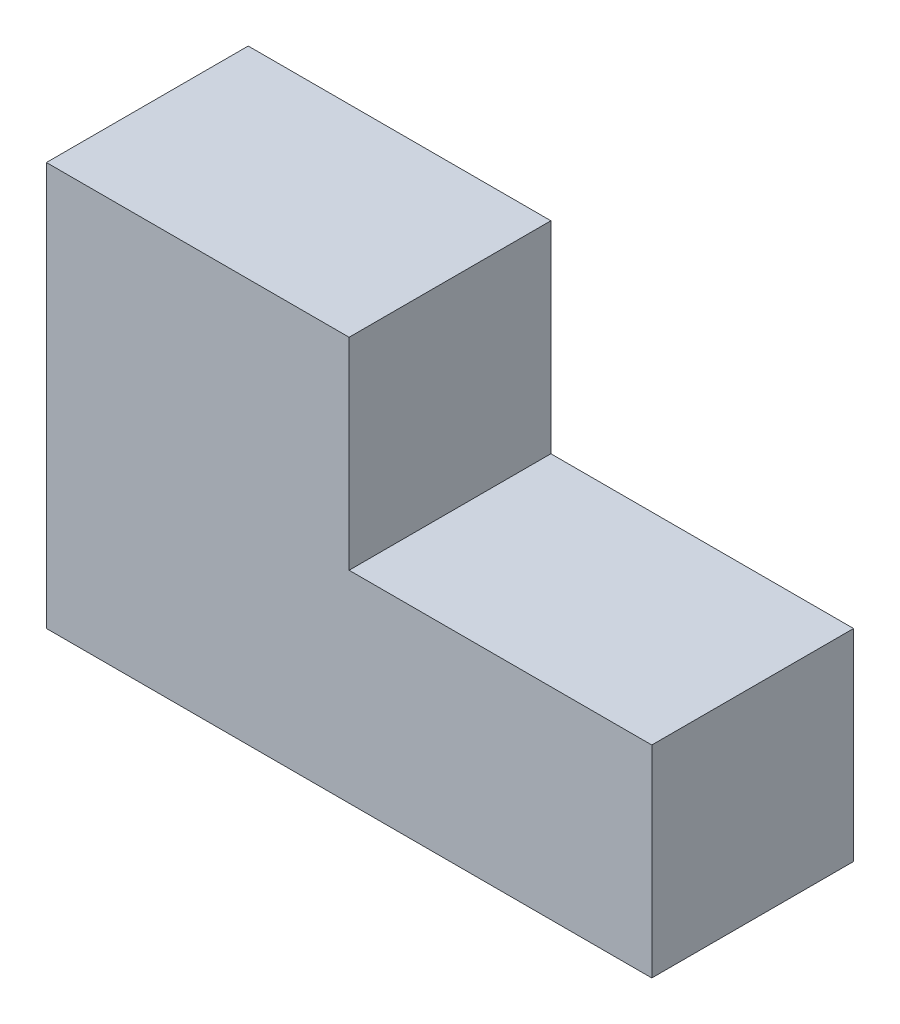
ISO-10303-21;
HEADER;
FILE_DESCRIPTION(('STEP AP214'),'2;1');
FILE_NAME('part.step','',(''),(''),'','','');
FILE_SCHEMA(('AUTOMOTIVE_DESIGN { 1 0 10303 214 1 1 1 1 }'));
ENDSEC;
DATA;
#1=APPLICATION_CONTEXT('core data for automotive mechanical design processes');
#2=APPLICATION_PROTOCOL_DEFINITION('international standard','automotive_design',2000,#1);
#3=PRODUCT_CONTEXT('',#1,'mechanical');
#4=PRODUCT('Part','Part','',(#3));
#5=PRODUCT_RELATED_PRODUCT_CATEGORY('part','',(#4));
#6=PRODUCT_DEFINITION_FORMATION('','',#4);
#7=PRODUCT_DEFINITION_CONTEXT('part definition',#1,'design');
#8=PRODUCT_DEFINITION('design','',#6,#7);
#9=PRODUCT_DEFINITION_SHAPE('','',#8);
#10=(LENGTH_UNIT() NAMED_UNIT(*) SI_UNIT(.MILLI.,.METRE.));
#11=(NAMED_UNIT(*) PLANE_ANGLE_UNIT() SI_UNIT($,.RADIAN.));
#12=(NAMED_UNIT(*) SI_UNIT($,.STERADIAN.) SOLID_ANGLE_UNIT());
#13=UNCERTAINTY_MEASURE_WITH_UNIT(LENGTH_MEASURE(1.E-05),#10,'distance_accuracy_value','');
#14=(GEOMETRIC_REPRESENTATION_CONTEXT(3) GLOBAL_UNCERTAINTY_ASSIGNED_CONTEXT((#13)) GLOBAL_UNIT_ASSIGNED_CONTEXT((#10,
#11,#12)) REPRESENTATION_CONTEXT('',''));
#15=CARTESIAN_POINT('',(0.,0.,0.));
#16=DIRECTION('',(0.,0.,1.));
#17=DIRECTION('',(1.,0.,0.));
#18=AXIS2_PLACEMENT_3D('',#15,#16,#17);
#19=CARTESIAN_POINT('',(0.,40.,20.));
#20=DIRECTION('',(1.,0.,0.));
#21=DIRECTION('',(0.,0.,-1.));
#22=AXIS2_PLACEMENT_3D('',#19,#20,#21);
#23=PLANE('',#22);
#24=DIRECTION('',(0.,-1.,0.));
#25=VECTOR('',#24,1.);
#26=CARTESIAN_POINT('',(0.,40.,0.));
#27=LINE('',#26,#25);
#28=CARTESIAN_POINT('',(0.,40.,0.));
#29=VERTEX_POINT('',#28);
#30=CARTESIAN_POINT('',(0.,0.,0.));
#31=VERTEX_POINT('',#30);
#32=EDGE_CURVE('E143',#29,#31,#27,.T.);
#33=ORIENTED_EDGE('',*,*,#32,.T.);
#34=DIRECTION('',(0.,0.,-1.));
#35=VECTOR('',#34,1.);
#36=CARTESIAN_POINT('',(0.,0.,20.));
#37=LINE('',#36,#35);
#38=CARTESIAN_POINT('',(0.,0.,20.));
#39=VERTEX_POINT('',#38);
#40=EDGE_CURVE('E11',#39,#31,#37,.T.);
#41=ORIENTED_EDGE('',*,*,#40,.F.);
#42=DIRECTION('',(0.,-1.,0.));
#43=VECTOR('',#42,1.);
#44=CARTESIAN_POINT('',(0.,40.,20.));
#45=LINE('',#44,#43);
#46=CARTESIAN_POINT('',(0.,40.,20.));
#47=VERTEX_POINT('',#46);
#48=EDGE_CURVE('E159',#47,#39,#45,.T.);
#49=ORIENTED_EDGE('',*,*,#48,.F.);
#50=DIRECTION('',(0.,0.,-1.));
#51=VECTOR('',#50,1.);
#52=CARTESIAN_POINT('',(0.,40.,20.));
#53=LINE('',#52,#51);
#54=EDGE_CURVE('E139',#47,#29,#53,.T.);
#55=ORIENTED_EDGE('',*,*,#54,.T.);
#56=EDGE_LOOP('',(#33,#41,#49,#55));
#57=FACE_BOUND('',#56,.T.);
#58=ADVANCED_FACE('F51',(#57),#23,.F.);
#59=CARTESIAN_POINT('',(0.,0.,20.));
#60=DIRECTION('',(0.,1.,0.));
#61=DIRECTION('',(0.,0.,1.));
#62=AXIS2_PLACEMENT_3D('',#59,#60,#61);
#63=PLANE('',#62);
#64=DIRECTION('',(1.,0.,0.));
#65=VECTOR('',#64,1.);
#66=CARTESIAN_POINT('',(0.,0.,0.));
#67=LINE('',#66,#65);
#68=CARTESIAN_POINT('',(60.,0.,0.));
#69=VERTEX_POINT('',#68);
#70=EDGE_CURVE('E147',#31,#69,#67,.T.);
#71=ORIENTED_EDGE('',*,*,#70,.T.);
#72=DIRECTION('',(0.,0.,-1.));
#73=VECTOR('',#72,1.);
#74=CARTESIAN_POINT('',(60.,0.,20.));
#75=LINE('',#74,#73);
#76=CARTESIAN_POINT('',(60.,0.,20.));
#77=VERTEX_POINT('',#76);
#78=EDGE_CURVE('E61',#77,#69,#75,.T.);
#79=ORIENTED_EDGE('',*,*,#78,.F.);
#80=DIRECTION('',(1.,0.,0.));
#81=VECTOR('',#80,1.);
#82=CARTESIAN_POINT('',(0.,0.,20.));
#83=LINE('',#82,#81);
#84=EDGE_CURVE('E106',#39,#77,#83,.T.);
#85=ORIENTED_EDGE('',*,*,#84,.F.);
#86=ORIENTED_EDGE('',*,*,#40,.T.);
#87=EDGE_LOOP('',(#71,#79,#85,#86));
#88=FACE_BOUND('',#87,.T.);
#89=ADVANCED_FACE('F187',(#88),#63,.F.);
#90=CARTESIAN_POINT('',(60.,0.,20.));
#91=DIRECTION('',(-1.,0.,0.));
#92=DIRECTION('',(0.,0.,1.));
#93=AXIS2_PLACEMENT_3D('',#90,#91,#92);
#94=PLANE('',#93);
#95=DIRECTION('',(0.,1.,0.));
#96=VECTOR('',#95,1.);
#97=CARTESIAN_POINT('',(60.,0.,0.));
#98=LINE('',#97,#96);
#99=CARTESIAN_POINT('',(60.,20.,0.));
#100=VERTEX_POINT('',#99);
#101=EDGE_CURVE('E150',#69,#100,#98,.T.);
#102=ORIENTED_EDGE('',*,*,#101,.T.);
#103=DIRECTION('',(0.,0.,-1.));
#104=VECTOR('',#103,1.);
#105=CARTESIAN_POINT('',(60.,20.,20.));
#106=LINE('',#105,#104);
#107=CARTESIAN_POINT('',(60.,20.,20.));
#108=VERTEX_POINT('',#107);
#109=EDGE_CURVE('E130',#108,#100,#106,.T.);
#110=ORIENTED_EDGE('',*,*,#109,.F.);
#111=DIRECTION('',(0.,1.,0.));
#112=VECTOR('',#111,1.);
#113=CARTESIAN_POINT('',(60.,0.,20.));
#114=LINE('',#113,#112);
#115=EDGE_CURVE('E119',#77,#108,#114,.T.);
#116=ORIENTED_EDGE('',*,*,#115,.F.);
#117=ORIENTED_EDGE('',*,*,#78,.T.);
#118=EDGE_LOOP('',(#102,#110,#116,#117));
#119=FACE_BOUND('',#118,.T.);
#120=ADVANCED_FACE('F169',(#119),#94,.F.);
#121=CARTESIAN_POINT('',(60.,20.,20.));
#122=DIRECTION('',(0.,-1.,0.));
#123=DIRECTION('',(0.,0.,-1.));
#124=AXIS2_PLACEMENT_3D('',#121,#122,#123);
#125=PLANE('',#124);
#126=DIRECTION('',(-1.,0.,0.));
#127=VECTOR('',#126,1.);
#128=CARTESIAN_POINT('',(60.,20.,0.));
#129=LINE('',#128,#127);
#130=CARTESIAN_POINT('',(30.,20.,0.));
#131=VERTEX_POINT('',#130);
#132=EDGE_CURVE('E128',#100,#131,#129,.T.);
#133=ORIENTED_EDGE('',*,*,#132,.T.);
#134=DIRECTION('',(0.,0.,-1.));
#135=VECTOR('',#134,1.);
#136=CARTESIAN_POINT('',(30.,20.,20.));
#137=LINE('',#136,#135);
#138=CARTESIAN_POINT('',(30.,20.,20.));
#139=VERTEX_POINT('',#138);
#140=EDGE_CURVE('E125',#139,#131,#137,.T.);
#141=ORIENTED_EDGE('',*,*,#140,.F.);
#142=DIRECTION('',(-1.,0.,0.));
#143=VECTOR('',#142,1.);
#144=CARTESIAN_POINT('',(60.,20.,20.));
#145=LINE('',#144,#143);
#146=EDGE_CURVE('E113',#108,#139,#145,.T.);
#147=ORIENTED_EDGE('',*,*,#146,.F.);
#148=ORIENTED_EDGE('',*,*,#109,.T.);
#149=EDGE_LOOP('',(#133,#141,#147,#148));
#150=FACE_BOUND('',#149,.T.);
#151=ADVANCED_FACE('F126',(#150),#125,.F.);
#152=CARTESIAN_POINT('',(30.,20.,20.));
#153=DIRECTION('',(-1.,0.,0.));
#154=DIRECTION('',(0.,0.,1.));
#155=AXIS2_PLACEMENT_3D('',#152,#153,#154);
#156=PLANE('',#155);
#157=DIRECTION('',(0.,1.,0.));
#158=VECTOR('',#157,1.);
#159=CARTESIAN_POINT('',(30.,20.,0.));
#160=LINE('',#159,#158);
#161=CARTESIAN_POINT('',(30.,40.,0.));
#162=VERTEX_POINT('',#161);
#163=EDGE_CURVE('E92',#131,#162,#160,.T.);
#164=ORIENTED_EDGE('',*,*,#163,.T.);
#165=DIRECTION('',(0.,0.,-1.));
#166=VECTOR('',#165,1.);
#167=CARTESIAN_POINT('',(30.,40.,20.));
#168=LINE('',#167,#166);
#169=CARTESIAN_POINT('',(30.,40.,20.));
#170=VERTEX_POINT('',#169);
#171=EDGE_CURVE('E131',#170,#162,#168,.T.);
#172=ORIENTED_EDGE('',*,*,#171,.F.);
#173=DIRECTION('',(0.,1.,0.));
#174=VECTOR('',#173,1.);
#175=CARTESIAN_POINT('',(30.,20.,20.));
#176=LINE('',#175,#174);
#177=EDGE_CURVE('E117',#139,#170,#176,.T.);
#178=ORIENTED_EDGE('',*,*,#177,.F.);
#179=ORIENTED_EDGE('',*,*,#140,.T.);
#180=EDGE_LOOP('',(#164,#172,#178,#179));
#181=FACE_BOUND('',#180,.T.);
#182=ADVANCED_FACE('F133',(#181),#156,.F.);
#183=CARTESIAN_POINT('',(30.,40.,20.));
#184=DIRECTION('',(0.,-1.,0.));
#185=DIRECTION('',(0.,0.,-1.));
#186=AXIS2_PLACEMENT_3D('',#183,#184,#185);
#187=PLANE('',#186);
#188=DIRECTION('',(-1.,0.,0.));
#189=VECTOR('',#188,1.);
#190=CARTESIAN_POINT('',(30.,40.,0.));
#191=LINE('',#190,#189);
#192=EDGE_CURVE('E98',#162,#29,#191,.T.);
#193=ORIENTED_EDGE('',*,*,#192,.T.);
#194=ORIENTED_EDGE('',*,*,#54,.F.);
#195=DIRECTION('',(-1.,0.,0.));
#196=VECTOR('',#195,1.);
#197=CARTESIAN_POINT('',(30.,40.,20.));
#198=LINE('',#197,#196);
#199=EDGE_CURVE('E69',#170,#47,#198,.T.);
#200=ORIENTED_EDGE('',*,*,#199,.F.);
#201=ORIENTED_EDGE('',*,*,#171,.T.);
#202=EDGE_LOOP('',(#193,#194,#200,#201));
#203=FACE_BOUND('',#202,.T.);
#204=ADVANCED_FACE('F176',(#203),#187,.F.);
#205=CARTESIAN_POINT('',(0.,0.,20.));
#206=DIRECTION('',(0.,0.,1.));
#207=DIRECTION('',(1.,0.,0.));
#208=AXIS2_PLACEMENT_3D('',#205,#206,#207);
#209=PLANE('',#208);
#210=ORIENTED_EDGE('',*,*,#48,.T.);
#211=ORIENTED_EDGE('',*,*,#84,.T.);
#212=ORIENTED_EDGE('',*,*,#115,.T.);
#213=ORIENTED_EDGE('',*,*,#146,.T.);
#214=ORIENTED_EDGE('',*,*,#177,.T.);
#215=ORIENTED_EDGE('',*,*,#199,.T.);
#216=EDGE_LOOP('',(#210,#211,#212,#213,#214,#215));
#217=FACE_BOUND('',#216,.T.);
#218=ADVANCED_FACE('F115',(#217),#209,.T.);
#219=CARTESIAN_POINT('',(0.,0.,0.));
#220=DIRECTION('',(0.,0.,1.));
#221=DIRECTION('',(1.,0.,0.));
#222=AXIS2_PLACEMENT_3D('',#219,#220,#221);
#223=PLANE('',#222);
#224=ORIENTED_EDGE('',*,*,#32,.F.);
#225=ORIENTED_EDGE('',*,*,#192,.F.);
#226=ORIENTED_EDGE('',*,*,#163,.F.);
#227=ORIENTED_EDGE('',*,*,#132,.F.);
#228=ORIENTED_EDGE('',*,*,#101,.F.);
#229=ORIENTED_EDGE('',*,*,#70,.F.);
#230=EDGE_LOOP('',(#224,#225,#226,#227,#228,#229));
#231=FACE_BOUND('',#230,.T.);
#232=ADVANCED_FACE('F172',(#231),#223,.F.);
#233=CLOSED_SHELL('',(#58,#89,#120,#151,#182,#204,#218,#232));
#234=MANIFOLD_SOLID_BREP('B2',#233);
#235=ADVANCED_BREP_SHAPE_REPRESENTATION('',(#18,#234),#14);
#236=SHAPE_DEFINITION_REPRESENTATION(#9,#235);
ENDSEC;
END-ISO-10303-21;
